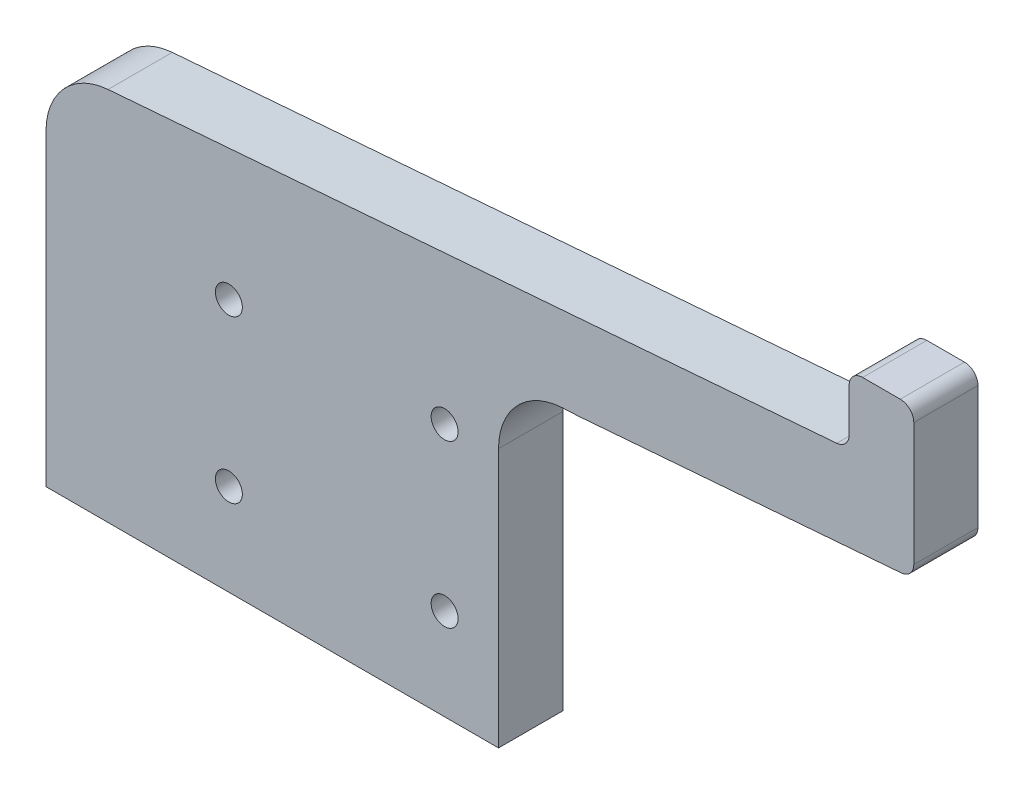
ISO-10303-21;
HEADER;
FILE_DESCRIPTION(('STEP AP214'),'2;1');
FILE_NAME('part.step','',(''),(''),'','','');
FILE_SCHEMA(('AUTOMOTIVE_DESIGN { 1 0 10303 214 1 1 1 1 }'));
ENDSEC;
DATA;
#1=APPLICATION_CONTEXT('core data for automotive mechanical design processes');
#2=APPLICATION_PROTOCOL_DEFINITION('international standard','automotive_design',2000,#1);
#3=PRODUCT_CONTEXT('',#1,'mechanical');
#4=PRODUCT('Part','Part','',(#3));
#5=PRODUCT_RELATED_PRODUCT_CATEGORY('part','',(#4));
#6=PRODUCT_DEFINITION_FORMATION('','',#4);
#7=PRODUCT_DEFINITION_CONTEXT('part definition',#1,'design');
#8=PRODUCT_DEFINITION('design','',#6,#7);
#9=PRODUCT_DEFINITION_SHAPE('','',#8);
#10=(LENGTH_UNIT() NAMED_UNIT(*) SI_UNIT(.MILLI.,.METRE.));
#11=(NAMED_UNIT(*) PLANE_ANGLE_UNIT() SI_UNIT($,.RADIAN.));
#12=(NAMED_UNIT(*) SI_UNIT($,.STERADIAN.) SOLID_ANGLE_UNIT());
#13=UNCERTAINTY_MEASURE_WITH_UNIT(LENGTH_MEASURE(1.E-05),#10,'distance_accuracy_value','');
#14=(GEOMETRIC_REPRESENTATION_CONTEXT(3) GLOBAL_UNCERTAINTY_ASSIGNED_CONTEXT((#13)) GLOBAL_UNIT_ASSIGNED_CONTEXT((#10,
#11,#12)) REPRESENTATION_CONTEXT('',''));
#15=CARTESIAN_POINT('',(0.,0.,0.));
#16=DIRECTION('',(0.,0.,1.));
#17=DIRECTION('',(1.,0.,0.));
#18=AXIS2_PLACEMENT_3D('',#15,#16,#17);
#19=CARTESIAN_POINT('',(48.,0.,6.35));
#20=DIRECTION('',(-1.,0.,0.));
#21=DIRECTION('',(0.,-1.,0.));
#22=AXIS2_PLACEMENT_3D('',#19,#20,#21);
#23=PLANE('',#22);
#24=DIRECTION('',(0.,1.,0.));
#25=VECTOR('',#24,1.);
#26=CARTESIAN_POINT('',(48.,0.,0.));
#27=LINE('',#26,#25);
#28=CARTESIAN_POINT('',(48.,-48.,0.));
#29=VERTEX_POINT('',#28);
#30=CARTESIAN_POINT('',(48.,-9.55341751649146,0.));
#31=VERTEX_POINT('',#30);
#32=EDGE_CURVE('E321',#29,#31,#27,.T.);
#33=ORIENTED_EDGE('',*,*,#32,.T.);
#34=DIRECTION('',(0.,0.,-1.));
#35=VECTOR('',#34,1.);
#36=CARTESIAN_POINT('',(48.,-9.55341751649146,6.35));
#37=LINE('',#36,#35);
#38=CARTESIAN_POINT('',(48.,-9.55341751649145,9.525));
#39=VERTEX_POINT('',#38);
#40=EDGE_CURVE('E422',#31,#39,#37,.F.);
#41=ORIENTED_EDGE('',*,*,#40,.T.);
#42=DIRECTION('',(0.,1.,0.));
#43=VECTOR('',#42,1.);
#44=CARTESIAN_POINT('',(48.,-48.,9.525));
#45=LINE('',#44,#43);
#46=CARTESIAN_POINT('',(48.,-48.,9.525));
#47=VERTEX_POINT('',#46);
#48=EDGE_CURVE('E248',#47,#39,#45,.T.);
#49=ORIENTED_EDGE('',*,*,#48,.F.);
#50=DIRECTION('',(0.,0.,-1.));
#51=VECTOR('',#50,1.);
#52=CARTESIAN_POINT('',(48.,-48.,6.35));
#53=LINE('',#52,#51);
#54=EDGE_CURVE('E413',#47,#29,#53,.T.);
#55=ORIENTED_EDGE('',*,*,#54,.T.);
#56=EDGE_LOOP('',(#33,#41,#49,#55));
#57=FACE_BOUND('',#56,.T.);
#58=ADVANCED_FACE('F35',(#57),#23,.F.);
#59=CARTESIAN_POINT('',(48.,0.,6.35));
#60=DIRECTION('',(-0.0456543881594155,0.998957294803832,0.));
#61=DIRECTION('',(-0.998957294803832,-0.0456543881594155,0.));
#62=AXIS2_PLACEMENT_3D('',#59,#60,#61);
#63=PLANE('',#62);
#64=DIRECTION('',(0.,0.,-1.));
#65=VECTOR('',#64,1.);
#66=CARTESIAN_POINT('',(59.6515632393399,0.532500231551201,6.35));
#67=LINE('',#66,#65);
#68=CARTESIAN_POINT('',(59.6515632393399,0.532500231551201,0.));
#69=VERTEX_POINT('',#68);
#70=CARTESIAN_POINT('',(59.6515632393399,0.5325002315512,9.525));
#71=VERTEX_POINT('',#70);
#72=EDGE_CURVE('E416',#69,#71,#67,.F.);
#73=ORIENTED_EDGE('',*,*,#72,.T.);
#74=DIRECTION('',(0.998957294803832,0.0456543881594152,0.));
#75=VECTOR('',#74,1.);
#76=CARTESIAN_POINT('',(57.5434561184058,0.43615543154686,9.525));
#77=LINE('',#76,#75);
#78=CARTESIAN_POINT('',(57.5434561184058,0.436155431546861,9.525));
#79=VERTEX_POINT('',#78);
#80=EDGE_CURVE('E256',#79,#71,#77,.T.);
#81=ORIENTED_EDGE('',*,*,#80,.F.);
#82=DIRECTION('',(0.,0.,-1.));
#83=VECTOR('',#82,1.);
#84=CARTESIAN_POINT('',(57.5434561184058,0.43615543154686,0.));
#85=LINE('',#84,#83);
#86=CARTESIAN_POINT('',(57.5434561184058,0.43615543154686,0.));
#87=VERTEX_POINT('',#86);
#88=EDGE_CURVE('E419',#79,#87,#85,.T.);
#89=ORIENTED_EDGE('',*,*,#88,.T.);
#90=DIRECTION('',(0.998957294803832,0.0456543881594155,0.));
#91=VECTOR('',#90,1.);
#92=CARTESIAN_POINT('',(48.,0.,0.));
#93=LINE('',#92,#91);
#94=EDGE_CURVE('E324',#87,#69,#93,.T.);
#95=ORIENTED_EDGE('',*,*,#94,.T.);
#96=EDGE_LOOP('',(#73,#81,#89,#95));
#97=FACE_BOUND('',#96,.T.);
#98=ADVANCED_FACE('F480',(#97),#63,.F.);
#99=CARTESIAN_POINT('',(59.8196674046978,0.540182935162639,6.35));
#100=DIRECTION('',(-0.0792398536366962,0.99685557910644,0.));
#101=DIRECTION('',(-0.99685557910644,-0.0792398536366962,0.));
#102=AXIS2_PLACEMENT_3D('',#99,#100,#101);
#103=PLANE('',#102);
#104=DIRECTION('',(0.99685557910644,0.0792398536366962,0.));
#105=VECTOR('',#104,1.);
#106=CARTESIAN_POINT('',(59.8196674046978,0.540182935162639,0.));
#107=LINE('',#106,#105);
#108=CARTESIAN_POINT('',(59.9874178941127,0.553517388525122,0.));
#109=VERTEX_POINT('',#108);
#110=CARTESIAN_POINT('',(107.745979707273,4.34983606024906,0.));
#111=VERTEX_POINT('',#110);
#112=EDGE_CURVE('E327',#109,#111,#107,.T.);
#113=ORIENTED_EDGE('',*,*,#112,.T.);
#114=DIRECTION('',(0.,0.,-1.));
#115=VECTOR('',#114,1.);
#116=CARTESIAN_POINT('',(107.745979707273,4.34983606024906,6.35));
#117=LINE('',#116,#115);
#118=CARTESIAN_POINT('',(107.745979707273,4.34983606024906,9.525));
#119=VERTEX_POINT('',#118);
#120=EDGE_CURVE('E443',#111,#119,#117,.F.);
#121=ORIENTED_EDGE('',*,*,#120,.T.);
#122=DIRECTION('',(0.996855579106439,0.0792398536366962,0.));
#123=VECTOR('',#122,1.);
#124=CARTESIAN_POINT('',(59.9874178941127,0.553517388525122,9.525));
#125=LINE('',#124,#123);
#126=CARTESIAN_POINT('',(59.9874178941127,0.55351738852512,9.525));
#127=VERTEX_POINT('',#126);
#128=EDGE_CURVE('E261',#127,#119,#125,.T.);
#129=ORIENTED_EDGE('',*,*,#128,.F.);
#130=DIRECTION('',(0.,0.,-1.));
#131=VECTOR('',#130,1.);
#132=CARTESIAN_POINT('',(59.9874178941127,0.553517388525122,6.35));
#133=LINE('',#132,#131);
#134=EDGE_CURVE('E425',#127,#109,#133,.T.);
#135=ORIENTED_EDGE('',*,*,#134,.T.);
#136=EDGE_LOOP('',(#113,#121,#129,#135));
#137=FACE_BOUND('',#136,.T.);
#138=ADVANCED_FACE('F488',(#137),#103,.F.);
#139=CARTESIAN_POINT('',(109.5875,4.49621814560135,6.35));
#140=DIRECTION('',(-1.,0.,0.));
#141=DIRECTION('',(0.,0.,1.));
#142=AXIS2_PLACEMENT_3D('',#139,#140,#141);
#143=PLANE('',#142);
#144=DIRECTION('',(0.,0.,-1.));
#145=VECTOR('',#144,1.);
#146=CARTESIAN_POINT('',(109.5875,24.592829183578,6.35));
#147=LINE('',#146,#145);
#148=CARTESIAN_POINT('',(109.5875,24.592829183578,0.));
#149=VERTEX_POINT('',#148);
#150=CARTESIAN_POINT('',(109.5875,24.592829183578,9.525));
#151=VERTEX_POINT('',#150);
#152=EDGE_CURVE('E433',#149,#151,#147,.F.);
#153=ORIENTED_EDGE('',*,*,#152,.T.);
#154=DIRECTION('',(0.,1.,0.));
#155=VECTOR('',#154,1.);
#156=CARTESIAN_POINT('',(109.5875,6.34354721846194,9.525));
#157=LINE('',#156,#155);
#158=CARTESIAN_POINT('',(109.5875,6.34354721846194,9.525));
#159=VERTEX_POINT('',#158);
#160=EDGE_CURVE('E266',#159,#151,#157,.T.);
#161=ORIENTED_EDGE('',*,*,#160,.F.);
#162=DIRECTION('',(0.,0.,-1.));
#163=VECTOR('',#162,1.);
#164=CARTESIAN_POINT('',(109.5875,6.34354721846194,6.35));
#165=LINE('',#164,#163);
#166=CARTESIAN_POINT('',(109.5875,6.34354721846194,0.));
#167=VERTEX_POINT('',#166);
#168=EDGE_CURVE('E436',#159,#167,#165,.T.);
#169=ORIENTED_EDGE('',*,*,#168,.T.);
#170=DIRECTION('',(0.,1.,0.));
#171=VECTOR('',#170,1.);
#172=CARTESIAN_POINT('',(109.5875,4.49621814560135,0.));
#173=LINE('',#172,#171);
#174=EDGE_CURVE('E330',#167,#149,#173,.T.);
#175=ORIENTED_EDGE('',*,*,#174,.T.);
#176=EDGE_LOOP('',(#153,#161,#169,#175));
#177=FACE_BOUND('',#176,.T.);
#178=ADVANCED_FACE('F495',(#177),#143,.F.);
#179=CARTESIAN_POINT('',(109.5875,26.592829183578,6.35));
#180=DIRECTION('',(0.,-1.,0.));
#181=DIRECTION('',(0.,0.,-1.));
#182=AXIS2_PLACEMENT_3D('',#179,#180,#181);
#183=PLANE('',#182);
#184=DIRECTION('',(0.,0.,-1.));
#185=VECTOR('',#184,1.);
#186=CARTESIAN_POINT('',(102.,26.592829183578,6.35));
#187=LINE('',#186,#185);
#188=CARTESIAN_POINT('',(102.,26.592829183578,0.));
#189=VERTEX_POINT('',#188);
#190=CARTESIAN_POINT('',(102.,26.592829183578,9.525));
#191=VERTEX_POINT('',#190);
#192=EDGE_CURVE('E446',#189,#191,#187,.F.);
#193=ORIENTED_EDGE('',*,*,#192,.T.);
#194=DIRECTION('',(-1.,0.,0.));
#195=VECTOR('',#194,1.);
#196=CARTESIAN_POINT('',(107.5875,26.592829183578,9.525));
#197=LINE('',#196,#195);
#198=CARTESIAN_POINT('',(107.5875,26.592829183578,9.525));
#199=VERTEX_POINT('',#198);
#200=EDGE_CURVE('E271',#199,#191,#197,.T.);
#201=ORIENTED_EDGE('',*,*,#200,.F.);
#202=DIRECTION('',(0.,0.,-1.));
#203=VECTOR('',#202,1.);
#204=CARTESIAN_POINT('',(107.5875,26.592829183578,6.35));
#205=LINE('',#204,#203);
#206=CARTESIAN_POINT('',(107.5875,26.592829183578,0.));
#207=VERTEX_POINT('',#206);
#208=EDGE_CURVE('E449',#199,#207,#205,.T.);
#209=ORIENTED_EDGE('',*,*,#208,.T.);
#210=DIRECTION('',(-1.,0.,0.));
#211=VECTOR('',#210,1.);
#212=CARTESIAN_POINT('',(109.5875,26.592829183578,0.));
#213=LINE('',#212,#211);
#214=EDGE_CURVE('E333',#207,#189,#213,.T.);
#215=ORIENTED_EDGE('',*,*,#214,.T.);
#216=EDGE_LOOP('',(#193,#201,#209,#215));
#217=FACE_BOUND('',#216,.T.);
#218=ADVANCED_FACE('F499',(#217),#183,.F.);
#219=CARTESIAN_POINT('',(100.,26.592829183578,6.35));
#220=DIRECTION('',(1.,0.,0.));
#221=DIRECTION('',(0.,0.,-1.));
#222=AXIS2_PLACEMENT_3D('',#219,#220,#221);
#223=PLANE('',#222);
#224=DIRECTION('',(0.,0.,-1.));
#225=VECTOR('',#224,1.);
#226=CARTESIAN_POINT('',(100.,18.2111518657295,6.35));
#227=LINE('',#226,#225);
#228=CARTESIAN_POINT('',(100.,18.2111518657295,0.));
#229=VERTEX_POINT('',#228);
#230=CARTESIAN_POINT('',(100.,18.2111518657295,9.525));
#231=VERTEX_POINT('',#230);
#232=EDGE_CURVE('E452',#229,#231,#227,.F.);
#233=ORIENTED_EDGE('',*,*,#232,.T.);
#234=DIRECTION('',(0.,-1.,0.));
#235=VECTOR('',#234,1.);
#236=CARTESIAN_POINT('',(100.,24.592829183578,9.525));
#237=LINE('',#236,#235);
#238=CARTESIAN_POINT('',(100.,24.592829183578,9.525));
#239=VERTEX_POINT('',#238);
#240=EDGE_CURVE('E276',#239,#231,#237,.T.);
#241=ORIENTED_EDGE('',*,*,#240,.F.);
#242=DIRECTION('',(0.,0.,-1.));
#243=VECTOR('',#242,1.);
#244=CARTESIAN_POINT('',(100.,24.592829183578,6.35));
#245=LINE('',#244,#243);
#246=CARTESIAN_POINT('',(100.,24.592829183578,0.));
#247=VERTEX_POINT('',#246);
#248=EDGE_CURVE('E455',#239,#247,#245,.T.);
#249=ORIENTED_EDGE('',*,*,#248,.T.);
#250=DIRECTION('',(0.,-1.,0.));
#251=VECTOR('',#250,1.);
#252=CARTESIAN_POINT('',(100.,26.592829183578,0.));
#253=LINE('',#252,#251);
#254=EDGE_CURVE('E335',#247,#229,#253,.T.);
#255=ORIENTED_EDGE('',*,*,#254,.T.);
#256=EDGE_LOOP('',(#233,#241,#249,#255));
#257=FACE_BOUND('',#256,.T.);
#258=ADVANCED_FACE('F506',(#257),#223,.F.);
#259=CARTESIAN_POINT('',(100.,16.3638227928689,6.35));
#260=DIRECTION('',(0.0792398536366963,-0.99685557910644,0.));
#261=DIRECTION('',(0.99685557910644,0.0792398536366963,0.));
#262=AXIS2_PLACEMENT_3D('',#259,#260,#261);
#263=PLANE('',#262);
#264=DIRECTION('',(0.,0.,-1.));
#265=VECTOR('',#264,1.);
#266=CARTESIAN_POINT('',(-9.91239853636693,7.62690788219861,6.35));
#267=LINE('',#266,#265);
#268=CARTESIAN_POINT('',(-9.91239853636693,7.62690788219861,0.));
#269=VERTEX_POINT('',#268);
#270=CARTESIAN_POINT('',(-9.91239853636693,7.62690788219861,9.525));
#271=VERTEX_POINT('',#270);
#272=EDGE_CURVE('E240',#269,#271,#267,.F.);
#273=ORIENTED_EDGE('',*,*,#272,.T.);
#274=DIRECTION('',(-0.99685557910644,-0.0792398536366963,0.));
#275=VECTOR('',#274,1.);
#276=CARTESIAN_POINT('',(98.1584797072734,16.2174407075166,9.525));
#277=LINE('',#276,#275);
#278=CARTESIAN_POINT('',(98.1584797072734,16.2174407075166,9.525));
#279=VERTEX_POINT('',#278);
#280=EDGE_CURVE('E227',#279,#271,#277,.T.);
#281=ORIENTED_EDGE('',*,*,#280,.F.);
#282=DIRECTION('',(0.,0.,-1.));
#283=VECTOR('',#282,1.);
#284=CARTESIAN_POINT('',(98.1584797072734,16.2174407075166,0.));
#285=LINE('',#284,#283);
#286=CARTESIAN_POINT('',(98.1584797072734,16.2174407075166,0.));
#287=VERTEX_POINT('',#286);
#288=EDGE_CURVE('E43',#279,#287,#285,.T.);
#289=ORIENTED_EDGE('',*,*,#288,.T.);
#290=DIRECTION('',(-0.99685557910644,-0.0792398536366963,0.));
#291=VECTOR('',#290,1.);
#292=CARTESIAN_POINT('',(100.,16.3638227928689,0.));
#293=LINE('',#292,#291);
#294=EDGE_CURVE('E338',#287,#269,#293,.T.);
#295=ORIENTED_EDGE('',*,*,#294,.T.);
#296=EDGE_LOOP('',(#273,#281,#289,#295));
#297=FACE_BOUND('',#296,.T.);
#298=ADVANCED_FACE('F460',(#297),#263,.F.);
#299=CARTESIAN_POINT('',(-19.12,6.89499745543717,6.35));
#300=DIRECTION('',(1.,0.,0.));
#301=DIRECTION('',(0.,1.,0.));
#302=AXIS2_PLACEMENT_3D('',#299,#300,#301);
#303=PLANE('',#302);
#304=DIRECTION('',(0.,0.,-1.));
#305=VECTOR('',#304,1.);
#306=CARTESIAN_POINT('',(-19.12,-48.,6.35));
#307=LINE('',#306,#305);
#308=CARTESIAN_POINT('',(-19.12,-48.,9.525));
#309=VERTEX_POINT('',#308);
#310=CARTESIAN_POINT('',(-19.12,-48.,0.));
#311=VERTEX_POINT('',#310);
#312=EDGE_CURVE('E245',#309,#311,#307,.T.);
#313=ORIENTED_EDGE('',*,*,#312,.F.);
#314=DIRECTION('',(0.,-1.,0.));
#315=VECTOR('',#314,1.);
#316=CARTESIAN_POINT('',(-19.12,-2.34164790886579,9.525));
#317=LINE('',#316,#315);
#318=CARTESIAN_POINT('',(-19.12,-2.34164790886579,9.525));
#319=VERTEX_POINT('',#318);
#320=EDGE_CURVE('E224',#319,#309,#317,.T.);
#321=ORIENTED_EDGE('',*,*,#320,.F.);
#322=DIRECTION('',(0.,0.,-1.));
#323=VECTOR('',#322,1.);
#324=CARTESIAN_POINT('',(-19.12,-2.34164790886579,6.35));
#325=LINE('',#324,#323);
#326=CARTESIAN_POINT('',(-19.12,-2.34164790886579,0.));
#327=VERTEX_POINT('',#326);
#328=EDGE_CURVE('E234',#319,#327,#325,.T.);
#329=ORIENTED_EDGE('',*,*,#328,.T.);
#330=DIRECTION('',(0.,-1.,0.));
#331=VECTOR('',#330,1.);
#332=CARTESIAN_POINT('',(-19.12,6.89499745543717,0.));
#333=LINE('',#332,#331);
#334=EDGE_CURVE('E341',#327,#311,#333,.T.);
#335=ORIENTED_EDGE('',*,*,#334,.T.);
#336=EDGE_LOOP('',(#313,#321,#329,#335));
#337=FACE_BOUND('',#336,.T.);
#338=ADVANCED_FACE('F243',(#337),#303,.F.);
#339=CARTESIAN_POINT('',(-19.12,-48.,6.35));
#340=DIRECTION('',(0.,1.,0.));
#341=DIRECTION('',(0.,0.,1.));
#342=AXIS2_PLACEMENT_3D('',#339,#340,#341);
#343=PLANE('',#342);
#344=DIRECTION('',(1.,0.,0.));
#345=VECTOR('',#344,1.);
#346=CARTESIAN_POINT('',(-19.12,-48.,0.));
#347=LINE('',#346,#345);
#348=CARTESIAN_POINT('',(-16.12,-48.,0.));
#349=VERTEX_POINT('',#348);
#350=EDGE_CURVE('E343',#311,#349,#347,.T.);
#351=ORIENTED_EDGE('',*,*,#350,.T.);
#352=DIRECTION('',(0.,0.,-1.));
#353=VECTOR('',#352,1.);
#354=CARTESIAN_POINT('',(-16.12,-48.,6.35));
#355=LINE('',#354,#353);
#356=CARTESIAN_POINT('',(-16.12,-48.,6.35));
#357=VERTEX_POINT('',#356);
#358=EDGE_CURVE('E409',#357,#349,#355,.T.);
#359=ORIENTED_EDGE('',*,*,#358,.F.);
#360=DIRECTION('',(1.,0.,0.));
#361=VECTOR('',#360,1.);
#362=CARTESIAN_POINT('',(-16.12,-48.,6.35));
#363=LINE('',#362,#361);
#364=CARTESIAN_POINT('',(-14.53,-48.,6.35));
#365=VERTEX_POINT('',#364);
#366=EDGE_CURVE('E231',#357,#365,#363,.T.);
#367=ORIENTED_EDGE('',*,*,#366,.T.);
#368=DIRECTION('',(0.,0.,-1.));
#369=VECTOR('',#368,1.);
#370=CARTESIAN_POINT('',(-14.53,-48.,6.35));
#371=LINE('',#370,#369);
#372=CARTESIAN_POINT('',(-14.53,-48.,0.));
#373=VERTEX_POINT('',#372);
#374=EDGE_CURVE('E319',#365,#373,#371,.T.);
#375=ORIENTED_EDGE('',*,*,#374,.T.);
#376=DIRECTION('',(1.,0.,0.));
#377=VECTOR('',#376,1.);
#378=CARTESIAN_POINT('',(-14.53,-48.,0.));
#379=LINE('',#378,#377);
#380=EDGE_CURVE('E282',#373,#29,#379,.T.);
#381=ORIENTED_EDGE('',*,*,#380,.T.);
#382=ORIENTED_EDGE('',*,*,#54,.F.);
#383=DIRECTION('',(1.,0.,0.));
#384=VECTOR('',#383,1.);
#385=CARTESIAN_POINT('',(-19.12,-48.,9.525));
#386=LINE('',#385,#384);
#387=EDGE_CURVE('E246',#309,#47,#386,.T.);
#388=ORIENTED_EDGE('',*,*,#387,.F.);
#389=ORIENTED_EDGE('',*,*,#312,.T.);
#390=EDGE_LOOP('',(#351,#359,#367,#375,#381,#382,#388,#389));
#391=FACE_BOUND('',#390,.T.);
#392=ADVANCED_FACE('F467',(#391),#343,.F.);
#393=CARTESIAN_POINT('',(-16.12,-5.11264151815669,6.35));
#394=DIRECTION('',(-1.,0.,0.));
#395=DIRECTION('',(0.,-1.,0.));
#396=AXIS2_PLACEMENT_3D('',#393,#394,#395);
#397=PLANE('',#396);
#398=DIRECTION('',(0.,1.,0.));
#399=VECTOR('',#398,1.);
#400=CARTESIAN_POINT('',(-16.12,-5.11264151815669,0.));
#401=LINE('',#400,#399);
#402=CARTESIAN_POINT('',(-16.12,-5.11264151815669,0.));
#403=VERTEX_POINT('',#402);
#404=EDGE_CURVE('E346',#349,#403,#401,.T.);
#405=ORIENTED_EDGE('',*,*,#404,.T.);
#406=DIRECTION('',(0.,0.,-1.));
#407=VECTOR('',#406,1.);
#408=CARTESIAN_POINT('',(-16.12,-5.11264151815669,6.35));
#409=LINE('',#408,#407);
#410=CARTESIAN_POINT('',(-16.12,-5.11264151815669,6.35));
#411=VERTEX_POINT('',#410);
#412=EDGE_CURVE('E406',#411,#403,#409,.T.);
#413=ORIENTED_EDGE('',*,*,#412,.F.);
#414=DIRECTION('',(0.,1.,0.));
#415=VECTOR('',#414,1.);
#416=CARTESIAN_POINT('',(-16.12,-5.11264151815669,6.35));
#417=LINE('',#416,#415);
#418=EDGE_CURVE('E286',#357,#411,#417,.T.);
#419=ORIENTED_EDGE('',*,*,#418,.F.);
#420=ORIENTED_EDGE('',*,*,#358,.T.);
#421=EDGE_LOOP('',(#405,#413,#419,#420));
#422=FACE_BOUND('',#421,.T.);
#423=ADVANCED_FACE('F593',(#422),#397,.F.);
#424=CARTESIAN_POINT('',(-6.11999999999999,-5.11264151815668,6.35));
#425=DIRECTION('',(0.,0.,-1.));
#426=DIRECTION('',(-1.,0.,0.));
#427=AXIS2_PLACEMENT_3D('',#424,#425,#426);
#428=CYLINDRICAL_SURFACE('',#427,10.);
#429=CARTESIAN_POINT('',(-6.11999999999999,-5.11264151815668,0.));
#430=DIRECTION('',(0.,0.,-1.));
#431=DIRECTION('',(1.,0.,0.));
#432=AXIS2_PLACEMENT_3D('',#429,#430,#431);
#433=CIRCLE('',#432,10.);
#434=CARTESIAN_POINT('',(-6.91239853636694,4.85591427290772,0.));
#435=VERTEX_POINT('',#434);
#436=EDGE_CURVE('E349',#403,#435,#433,.T.);
#437=ORIENTED_EDGE('',*,*,#436,.T.);
#438=DIRECTION('',(0.,0.,-1.));
#439=VECTOR('',#438,1.);
#440=CARTESIAN_POINT('',(-6.91239853636694,4.85591427290772,6.35));
#441=LINE('',#440,#439);
#442=CARTESIAN_POINT('',(-6.91239853636694,4.85591427290772,6.35));
#443=VERTEX_POINT('',#442);
#444=EDGE_CURVE('E403',#443,#435,#441,.T.);
#445=ORIENTED_EDGE('',*,*,#444,.F.);
#446=CARTESIAN_POINT('',(-6.11999999999999,-5.11264151815668,6.35));
#447=DIRECTION('',(0.,0.,-1.));
#448=DIRECTION('',(1.,0.,0.));
#449=AXIS2_PLACEMENT_3D('',#446,#447,#448);
#450=CIRCLE('',#449,10.);
#451=EDGE_CURVE('E289',#411,#443,#450,.T.);
#452=ORIENTED_EDGE('',*,*,#451,.F.);
#453=ORIENTED_EDGE('',*,*,#412,.T.);
#454=EDGE_LOOP('',(#437,#445,#452,#453));
#455=FACE_BOUND('',#454,.T.);
#456=ADVANCED_FACE('F589',(#455),#428,.F.);
#457=CARTESIAN_POINT('',(99.3169594145468,13.3000650128734,6.35));
#458=DIRECTION('',(-0.0792398536366961,0.99685557910644,0.));
#459=DIRECTION('',(-0.99685557910644,-0.0792398536366962,0.));
#460=AXIS2_PLACEMENT_3D('',#457,#458,#459);
#461=PLANE('',#460);
#462=DIRECTION('',(0.99685557910644,0.0792398536366962,0.));
#463=VECTOR('',#462,1.);
#464=CARTESIAN_POINT('',(99.3169594145468,13.3000650128734,0.));
#465=LINE('',#464,#463);
#466=CARTESIAN_POINT('',(99.3169594145468,13.3000650128734,0.));
#467=VERTEX_POINT('',#466);
#468=EDGE_CURVE('E352',#435,#467,#465,.T.);
#469=ORIENTED_EDGE('',*,*,#468,.T.);
#470=DIRECTION('',(0.,0.,-1.));
#471=VECTOR('',#470,1.);
#472=CARTESIAN_POINT('',(99.3169594145468,13.3000650128734,6.35));
#473=LINE('',#472,#471);
#474=CARTESIAN_POINT('',(99.3169594145468,13.3000650128734,6.35));
#475=VERTEX_POINT('',#474);
#476=EDGE_CURVE('E400',#475,#467,#473,.T.);
#477=ORIENTED_EDGE('',*,*,#476,.F.);
#478=DIRECTION('',(0.99685557910644,0.0792398536366962,0.));
#479=VECTOR('',#478,1.);
#480=CARTESIAN_POINT('',(99.3169594145468,13.3000650128734,6.35));
#481=LINE('',#480,#479);
#482=EDGE_CURVE('E293',#443,#475,#481,.T.);
#483=ORIENTED_EDGE('',*,*,#482,.F.);
#484=ORIENTED_EDGE('',*,*,#444,.T.);
#485=EDGE_LOOP('',(#469,#477,#483,#484));
#486=FACE_BOUND('',#485,.T.);
#487=ADVANCED_FACE('F585',(#486),#461,.F.);
#488=CARTESIAN_POINT('',(99.,17.2874873292992,6.35));
#489=DIRECTION('',(0.,0.,-1.));
#490=DIRECTION('',(-1.,0.,0.));
#491=AXIS2_PLACEMENT_3D('',#488,#489,#490);
#492=CYLINDRICAL_SURFACE('',#491,4.);
#493=CARTESIAN_POINT('',(99.,17.2874873292992,0.));
#494=DIRECTION('',(0.,0.,1.));
#495=DIRECTION('',(1.,0.,0.));
#496=AXIS2_PLACEMENT_3D('',#493,#494,#495);
#497=CIRCLE('',#496,4.);
#498=CARTESIAN_POINT('',(103.,17.2874873292992,0.));
#499=VERTEX_POINT('',#498);
#500=EDGE_CURVE('E355',#467,#499,#497,.T.);
#501=ORIENTED_EDGE('',*,*,#500,.T.);
#502=DIRECTION('',(0.,0.,-1.));
#503=VECTOR('',#502,1.);
#504=CARTESIAN_POINT('',(103.,17.2874873292992,6.35));
#505=LINE('',#504,#503);
#506=CARTESIAN_POINT('',(103.,17.2874873292992,6.35));
#507=VERTEX_POINT('',#506);
#508=EDGE_CURVE('E397',#507,#499,#505,.T.);
#509=ORIENTED_EDGE('',*,*,#508,.F.);
#510=CARTESIAN_POINT('',(99.,17.2874873292992,6.35));
#511=DIRECTION('',(0.,0.,1.));
#512=DIRECTION('',(1.,0.,0.));
#513=AXIS2_PLACEMENT_3D('',#510,#511,#512);
#514=CIRCLE('',#513,4.);
#515=EDGE_CURVE('E296',#475,#507,#514,.T.);
#516=ORIENTED_EDGE('',*,*,#515,.F.);
#517=ORIENTED_EDGE('',*,*,#476,.T.);
#518=EDGE_LOOP('',(#501,#509,#516,#517));
#519=FACE_BOUND('',#518,.T.);
#520=ADVANCED_FACE('F581',(#519),#492,.T.);
#521=CARTESIAN_POINT('',(103.,23.592829183578,6.35));
#522=DIRECTION('',(-1.,0.,0.));
#523=DIRECTION('',(0.,0.,1.));
#524=AXIS2_PLACEMENT_3D('',#521,#522,#523);
#525=PLANE('',#524);
#526=DIRECTION('',(0.,1.,0.));
#527=VECTOR('',#526,1.);
#528=CARTESIAN_POINT('',(103.,23.592829183578,0.));
#529=LINE('',#528,#527);
#530=CARTESIAN_POINT('',(103.,23.592829183578,0.));
#531=VERTEX_POINT('',#530);
#532=EDGE_CURVE('E358',#499,#531,#529,.T.);
#533=ORIENTED_EDGE('',*,*,#532,.T.);
#534=DIRECTION('',(0.,0.,-1.));
#535=VECTOR('',#534,1.);
#536=CARTESIAN_POINT('',(103.,23.592829183578,6.35));
#537=LINE('',#536,#535);
#538=CARTESIAN_POINT('',(103.,23.592829183578,6.35));
#539=VERTEX_POINT('',#538);
#540=EDGE_CURVE('E394',#539,#531,#537,.T.);
#541=ORIENTED_EDGE('',*,*,#540,.F.);
#542=DIRECTION('',(0.,1.,0.));
#543=VECTOR('',#542,1.);
#544=CARTESIAN_POINT('',(103.,23.592829183578,6.35));
#545=LINE('',#544,#543);
#546=EDGE_CURVE('E299',#507,#539,#545,.T.);
#547=ORIENTED_EDGE('',*,*,#546,.F.);
#548=ORIENTED_EDGE('',*,*,#508,.T.);
#549=EDGE_LOOP('',(#533,#541,#547,#548));
#550=FACE_BOUND('',#549,.T.);
#551=ADVANCED_FACE('F577',(#550),#525,.F.);
#552=CARTESIAN_POINT('',(104.5875,23.592829183578,6.35));
#553=DIRECTION('',(0.,1.,0.));
#554=DIRECTION('',(0.,0.,1.));
#555=AXIS2_PLACEMENT_3D('',#552,#553,#554);
#556=PLANE('',#555);
#557=DIRECTION('',(1.,0.,0.));
#558=VECTOR('',#557,1.);
#559=CARTESIAN_POINT('',(104.5875,23.592829183578,0.));
#560=LINE('',#559,#558);
#561=CARTESIAN_POINT('',(104.5875,23.592829183578,0.));
#562=VERTEX_POINT('',#561);
#563=EDGE_CURVE('E361',#531,#562,#560,.T.);
#564=ORIENTED_EDGE('',*,*,#563,.T.);
#565=DIRECTION('',(0.,0.,-1.));
#566=VECTOR('',#565,1.);
#567=CARTESIAN_POINT('',(104.5875,23.592829183578,6.35));
#568=LINE('',#567,#566);
#569=CARTESIAN_POINT('',(104.5875,23.592829183578,6.35));
#570=VERTEX_POINT('',#569);
#571=EDGE_CURVE('E391',#570,#562,#568,.T.);
#572=ORIENTED_EDGE('',*,*,#571,.F.);
#573=DIRECTION('',(1.,0.,0.));
#574=VECTOR('',#573,1.);
#575=CARTESIAN_POINT('',(104.5875,23.592829183578,6.35));
#576=LINE('',#575,#574);
#577=EDGE_CURVE('E302',#539,#570,#576,.T.);
#578=ORIENTED_EDGE('',*,*,#577,.F.);
#579=ORIENTED_EDGE('',*,*,#540,.T.);
#580=EDGE_LOOP('',(#564,#572,#578,#579));
#581=FACE_BOUND('',#580,.T.);
#582=ADVANCED_FACE('F573',(#581),#556,.F.);
#583=CARTESIAN_POINT('',(104.5875,15.8186619918674,6.35));
#584=DIRECTION('',(1.,0.,0.));
#585=DIRECTION('',(0.,0.,-1.));
#586=AXIS2_PLACEMENT_3D('',#583,#584,#585);
#587=PLANE('',#586);
#588=DIRECTION('',(0.,-1.,0.));
#589=VECTOR('',#588,1.);
#590=CARTESIAN_POINT('',(104.5875,15.8186619918674,0.));
#591=LINE('',#590,#589);
#592=CARTESIAN_POINT('',(104.5875,15.8186619918674,0.));
#593=VERTEX_POINT('',#592);
#594=EDGE_CURVE('E364',#562,#593,#591,.T.);
#595=ORIENTED_EDGE('',*,*,#594,.T.);
#596=DIRECTION('',(0.,0.,-1.));
#597=VECTOR('',#596,1.);
#598=CARTESIAN_POINT('',(104.5875,15.8186619918674,6.35));
#599=LINE('',#598,#597);
#600=CARTESIAN_POINT('',(104.5875,15.8186619918674,6.35));
#601=VERTEX_POINT('',#600);
#602=EDGE_CURVE('E388',#601,#593,#599,.T.);
#603=ORIENTED_EDGE('',*,*,#602,.F.);
#604=DIRECTION('',(0.,-1.,0.));
#605=VECTOR('',#604,1.);
#606=CARTESIAN_POINT('',(104.5875,15.8186619918674,6.35));
#607=LINE('',#606,#605);
#608=EDGE_CURVE('E305',#570,#601,#607,.T.);
#609=ORIENTED_EDGE('',*,*,#608,.F.);
#610=ORIENTED_EDGE('',*,*,#571,.T.);
#611=EDGE_LOOP('',(#595,#603,#609,#610));
#612=FACE_BOUND('',#611,.T.);
#613=ADVANCED_FACE('F569',(#612),#587,.F.);
#614=CARTESIAN_POINT('',(100.5875,15.8186619918674,6.35));
#615=DIRECTION('',(0.,0.,-1.));
#616=DIRECTION('',(-1.,0.,0.));
#617=AXIS2_PLACEMENT_3D('',#614,#615,#616);
#618=CYLINDRICAL_SURFACE('',#617,4.);
#619=CARTESIAN_POINT('',(100.5875,15.8186619918674,0.));
#620=DIRECTION('',(0.,0.,-1.));
#621=DIRECTION('',(1.,0.,0.));
#622=AXIS2_PLACEMENT_3D('',#619,#620,#621);
#623=CIRCLE('',#622,4.);
#624=CARTESIAN_POINT('',(100.904459414547,11.8312396754417,0.));
#625=VERTEX_POINT('',#624);
#626=EDGE_CURVE('E367',#593,#625,#623,.T.);
#627=ORIENTED_EDGE('',*,*,#626,.T.);
#628=DIRECTION('',(0.,0.,-1.));
#629=VECTOR('',#628,1.);
#630=CARTESIAN_POINT('',(100.904459414547,11.8312396754417,6.35));
#631=LINE('',#630,#629);
#632=CARTESIAN_POINT('',(100.904459414547,11.8312396754417,6.35));
#633=VERTEX_POINT('',#632);
#634=EDGE_CURVE('E385',#633,#625,#631,.T.);
#635=ORIENTED_EDGE('',*,*,#634,.F.);
#636=CARTESIAN_POINT('',(100.5875,15.8186619918674,6.35));
#637=DIRECTION('',(0.,0.,-1.));
#638=DIRECTION('',(1.,0.,0.));
#639=AXIS2_PLACEMENT_3D('',#636,#637,#638);
#640=CIRCLE('',#639,4.);
#641=EDGE_CURVE('E308',#601,#633,#640,.T.);
#642=ORIENTED_EDGE('',*,*,#641,.F.);
#643=ORIENTED_EDGE('',*,*,#602,.T.);
#644=EDGE_LOOP('',(#627,#635,#642,#643));
#645=FACE_BOUND('',#644,.T.);
#646=ADVANCED_FACE('F565',(#645),#618,.F.);
#647=CARTESIAN_POINT('',(-5.32239853636693,3.38728765998354,6.35));
#648=DIRECTION('',(0.0792398536366962,-0.99685557910644,0.));
#649=DIRECTION('',(0.99685557910644,0.0792398536366962,0.));
#650=AXIS2_PLACEMENT_3D('',#647,#648,#649);
#651=PLANE('',#650);
#652=DIRECTION('',(-0.99685557910644,-0.0792398536366962,0.));
#653=VECTOR('',#652,1.);
#654=CARTESIAN_POINT('',(-5.32239853636693,3.38728765998354,0.));
#655=LINE('',#654,#653);
#656=CARTESIAN_POINT('',(-5.32239853636693,3.38728765998354,0.));
#657=VERTEX_POINT('',#656);
#658=EDGE_CURVE('E370',#625,#657,#655,.T.);
#659=ORIENTED_EDGE('',*,*,#658,.T.);
#660=DIRECTION('',(0.,0.,-1.));
#661=VECTOR('',#660,1.);
#662=CARTESIAN_POINT('',(-5.32239853636693,3.38728765998354,6.35));
#663=LINE('',#662,#661);
#664=CARTESIAN_POINT('',(-5.32239853636693,3.38728765998354,6.35));
#665=VERTEX_POINT('',#664);
#666=EDGE_CURVE('E382',#665,#657,#663,.T.);
#667=ORIENTED_EDGE('',*,*,#666,.F.);
#668=DIRECTION('',(-0.99685557910644,-0.0792398536366962,0.));
#669=VECTOR('',#668,1.);
#670=CARTESIAN_POINT('',(-5.32239853636693,3.38728765998354,6.35));
#671=LINE('',#670,#669);
#672=EDGE_CURVE('E311',#633,#665,#671,.T.);
#673=ORIENTED_EDGE('',*,*,#672,.F.);
#674=ORIENTED_EDGE('',*,*,#634,.T.);
#675=EDGE_LOOP('',(#659,#667,#673,#674));
#676=FACE_BOUND('',#675,.T.);
#677=ADVANCED_FACE('F561',(#676),#651,.F.);
#678=CARTESIAN_POINT('',(-4.52999999999998,-6.58126813108086,6.35));
#679=DIRECTION('',(0.,0.,-1.));
#680=DIRECTION('',(-1.,0.,0.));
#681=AXIS2_PLACEMENT_3D('',#678,#679,#680);
#682=CYLINDRICAL_SURFACE('',#681,10.);
#683=CARTESIAN_POINT('',(-4.52999999999998,-6.58126813108086,0.));
#684=DIRECTION('',(0.,0.,1.));
#685=DIRECTION('',(1.,0.,0.));
#686=AXIS2_PLACEMENT_3D('',#683,#684,#685);
#687=CIRCLE('',#686,10.);
#688=CARTESIAN_POINT('',(-14.53,-6.58126813108086,0.));
#689=VERTEX_POINT('',#688);
#690=EDGE_CURVE('E373',#657,#689,#687,.T.);
#691=ORIENTED_EDGE('',*,*,#690,.T.);
#692=DIRECTION('',(0.,0.,-1.));
#693=VECTOR('',#692,1.);
#694=CARTESIAN_POINT('',(-14.53,-6.58126813108086,6.35));
#695=LINE('',#694,#693);
#696=CARTESIAN_POINT('',(-14.53,-6.58126813108086,6.35));
#697=VERTEX_POINT('',#696);
#698=EDGE_CURVE('E379',#697,#689,#695,.T.);
#699=ORIENTED_EDGE('',*,*,#698,.F.);
#700=CARTESIAN_POINT('',(-4.52999999999998,-6.58126813108086,6.35));
#701=DIRECTION('',(0.,0.,1.));
#702=DIRECTION('',(1.,0.,0.));
#703=AXIS2_PLACEMENT_3D('',#700,#701,#702);
#704=CIRCLE('',#703,10.);
#705=EDGE_CURVE('E314',#665,#697,#704,.T.);
#706=ORIENTED_EDGE('',*,*,#705,.F.);
#707=ORIENTED_EDGE('',*,*,#666,.T.);
#708=EDGE_LOOP('',(#691,#699,#706,#707));
#709=FACE_BOUND('',#708,.T.);
#710=ADVANCED_FACE('F557',(#709),#682,.T.);
#711=CARTESIAN_POINT('',(-14.53,-48.,6.35));
#712=DIRECTION('',(1.,0.,0.));
#713=DIRECTION('',(0.,0.,-1.));
#714=AXIS2_PLACEMENT_3D('',#711,#712,#713);
#715=PLANE('',#714);
#716=DIRECTION('',(0.,-1.,0.));
#717=VECTOR('',#716,1.);
#718=CARTESIAN_POINT('',(-14.53,-48.,0.));
#719=LINE('',#718,#717);
#720=EDGE_CURVE('E290',#689,#373,#719,.T.);
#721=ORIENTED_EDGE('',*,*,#720,.T.);
#722=ORIENTED_EDGE('',*,*,#374,.F.);
#723=DIRECTION('',(0.,-1.,0.));
#724=VECTOR('',#723,1.);
#725=CARTESIAN_POINT('',(-14.53,-48.,6.35));
#726=LINE('',#725,#724);
#727=EDGE_CURVE('E317',#697,#365,#726,.T.);
#728=ORIENTED_EDGE('',*,*,#727,.F.);
#729=ORIENTED_EDGE('',*,*,#698,.T.);
#730=EDGE_LOOP('',(#721,#722,#728,#729));
#731=FACE_BOUND('',#730,.T.);
#732=ADVANCED_FACE('F553',(#731),#715,.F.);
#733=CARTESIAN_POINT('',(-6.11999999999999,-5.11264151815668,0.));
#734=DIRECTION('',(0.,0.,1.));
#735=DIRECTION('',(1.,0.,0.));
#736=AXIS2_PLACEMENT_3D('',#733,#734,#735);
#737=PLANE('',#736);
#738=CARTESIAN_POINT('',(40.,-10.4071708164219,0.));
#739=DIRECTION('',(0.,0.,1.));
#740=DIRECTION('',(1.,0.,0.));
#741=AXIS2_PLACEMENT_3D('',#738,#739,#740);
#742=CIRCLE('',#741,2.);
#743=CARTESIAN_POINT('',(42.,-10.4071708164219,0.));
#744=VERTEX_POINT('',#743);
#745=EDGE_CURVE('E767',#744,#744,#742,.T.);
#746=ORIENTED_EDGE('',*,*,#745,.T.);
#747=EDGE_LOOP('',(#746));
#748=FACE_BOUND('',#747,.T.);
#749=CARTESIAN_POINT('',(8.00000000000002,-34.4071708164219,0.));
#750=DIRECTION('',(0.,0.,1.));
#751=DIRECTION('',(1.,0.,0.));
#752=AXIS2_PLACEMENT_3D('',#749,#750,#751);
#753=CIRCLE('',#752,2.);
#754=CARTESIAN_POINT('',(10.,-34.4071708164219,0.));
#755=VERTEX_POINT('',#754);
#756=EDGE_CURVE('E771',#755,#755,#753,.T.);
#757=ORIENTED_EDGE('',*,*,#756,.T.);
#758=EDGE_LOOP('',(#757));
#759=FACE_BOUND('',#758,.T.);
#760=CARTESIAN_POINT('',(40.,-34.4071708164219,0.));
#761=DIRECTION('',(0.,0.,1.));
#762=DIRECTION('',(1.,0.,0.));
#763=AXIS2_PLACEMENT_3D('',#760,#761,#762);
#764=CIRCLE('',#763,2.);
#765=CARTESIAN_POINT('',(42.,-34.4071708164219,0.));
#766=VERTEX_POINT('',#765);
#767=EDGE_CURVE('E782',#766,#766,#764,.T.);
#768=ORIENTED_EDGE('',*,*,#767,.T.);
#769=EDGE_LOOP('',(#768));
#770=FACE_BOUND('',#769,.T.);
#771=CARTESIAN_POINT('',(8.00000000000002,-10.4071708164219,0.));
#772=DIRECTION('',(0.,0.,1.));
#773=DIRECTION('',(1.,0.,0.));
#774=AXIS2_PLACEMENT_3D('',#771,#772,#773);
#775=CIRCLE('',#774,2.);
#776=CARTESIAN_POINT('',(10.,-10.4071708164219,0.));
#777=VERTEX_POINT('',#776);
#778=EDGE_CURVE('E285',#777,#777,#775,.T.);
#779=ORIENTED_EDGE('',*,*,#778,.T.);
#780=EDGE_LOOP('',(#779));
#781=FACE_BOUND('',#780,.T.);
#782=ORIENTED_EDGE('',*,*,#174,.F.);
#783=CARTESIAN_POINT('',(107.5875,6.34354721846194,0.));
#784=DIRECTION('',(0.,0.,1.));
#785=DIRECTION('',(1.,0.,0.));
#786=AXIS2_PLACEMENT_3D('',#783,#784,#785);
#787=CIRCLE('',#786,2.);
#788=EDGE_CURVE('E441',#167,#111,#787,.F.);
#789=ORIENTED_EDGE('',*,*,#788,.T.);
#790=ORIENTED_EDGE('',*,*,#112,.F.);
#791=CARTESIAN_POINT('',(59.1950193577458,10.5220731795895,0.));
#792=DIRECTION('',(0.,0.,1.));
#793=DIRECTION('',(1.,0.,0.));
#794=AXIS2_PLACEMENT_3D('',#791,#792,#793);
#795=CIRCLE('',#794,10.);
#796=EDGE_CURVE('E241',#109,#69,#795,.F.);
#797=ORIENTED_EDGE('',*,*,#796,.T.);
#798=ORIENTED_EDGE('',*,*,#94,.F.);
#799=CARTESIAN_POINT('',(58.,-9.55341751649146,0.));
#800=DIRECTION('',(0.,0.,1.));
#801=DIRECTION('',(1.,0.,0.));
#802=AXIS2_PLACEMENT_3D('',#799,#800,#801);
#803=CIRCLE('',#802,10.);
#804=EDGE_CURVE('E431',#87,#31,#803,.T.);
#805=ORIENTED_EDGE('',*,*,#804,.T.);
#806=ORIENTED_EDGE('',*,*,#32,.F.);
#807=ORIENTED_EDGE('',*,*,#380,.F.);
#808=ORIENTED_EDGE('',*,*,#720,.F.);
#809=ORIENTED_EDGE('',*,*,#690,.F.);
#810=ORIENTED_EDGE('',*,*,#658,.F.);
#811=ORIENTED_EDGE('',*,*,#626,.F.);
#812=ORIENTED_EDGE('',*,*,#594,.F.);
#813=ORIENTED_EDGE('',*,*,#563,.F.);
#814=ORIENTED_EDGE('',*,*,#532,.F.);
#815=ORIENTED_EDGE('',*,*,#500,.F.);
#816=ORIENTED_EDGE('',*,*,#468,.F.);
#817=ORIENTED_EDGE('',*,*,#436,.F.);
#818=ORIENTED_EDGE('',*,*,#404,.F.);
#819=ORIENTED_EDGE('',*,*,#350,.F.);
#820=ORIENTED_EDGE('',*,*,#334,.F.);
#821=CARTESIAN_POINT('',(-9.11999999999998,-2.34164790886579,0.));
#822=DIRECTION('',(0.,0.,1.));
#823=DIRECTION('',(1.,0.,0.));
#824=AXIS2_PLACEMENT_3D('',#821,#822,#823);
#825=CIRCLE('',#824,10.);
#826=EDGE_CURVE('E236',#327,#269,#825,.F.);
#827=ORIENTED_EDGE('',*,*,#826,.T.);
#828=ORIENTED_EDGE('',*,*,#294,.F.);
#829=CARTESIAN_POINT('',(98.,18.2111518657295,0.));
#830=DIRECTION('',(0.,0.,1.));
#831=DIRECTION('',(1.,0.,0.));
#832=AXIS2_PLACEMENT_3D('',#829,#830,#831);
#833=CIRCLE('',#832,2.);
#834=EDGE_CURVE('E11',#287,#229,#833,.T.);
#835=ORIENTED_EDGE('',*,*,#834,.T.);
#836=ORIENTED_EDGE('',*,*,#254,.F.);
#837=CARTESIAN_POINT('',(102.,24.592829183578,0.));
#838=DIRECTION('',(0.,0.,1.));
#839=DIRECTION('',(1.,0.,0.));
#840=AXIS2_PLACEMENT_3D('',#837,#838,#839);
#841=CIRCLE('',#840,2.);
#842=EDGE_CURVE('E50',#247,#189,#841,.F.);
#843=ORIENTED_EDGE('',*,*,#842,.T.);
#844=ORIENTED_EDGE('',*,*,#214,.F.);
#845=CARTESIAN_POINT('',(107.5875,24.592829183578,0.));
#846=DIRECTION('',(0.,0.,1.));
#847=DIRECTION('',(1.,0.,0.));
#848=AXIS2_PLACEMENT_3D('',#845,#846,#847);
#849=CIRCLE('',#848,2.);
#850=EDGE_CURVE('E58',#207,#149,#849,.F.);
#851=ORIENTED_EDGE('',*,*,#850,.T.);
#852=EDGE_LOOP('',(#782,#789,#790,#797,#798,#805,#806,#807,#808,#809,#810,#811,#812,#813,#814,
#815,#816,#817,#818,#819,#820,#827,#828,#835,#836,#843,#844,#851));
#853=FACE_BOUND('',#852,.T.);
#854=ADVANCED_FACE('F465',(#748,#759,#770,#781,#853),#737,.F.);
#855=CARTESIAN_POINT('',(58.,-9.55341751649146,6.35));
#856=DIRECTION('',(0.,0.,1.));
#857=DIRECTION('',(1.,0.,0.));
#858=AXIS2_PLACEMENT_3D('',#855,#856,#857);
#859=CYLINDRICAL_SURFACE('',#858,10.);
#860=ORIENTED_EDGE('',*,*,#88,.F.);
#861=CARTESIAN_POINT('',(58.,-9.55341751649146,9.525));
#862=DIRECTION('',(0.,0.,-1.));
#863=DIRECTION('',(1.,0.,0.));
#864=AXIS2_PLACEMENT_3D('',#861,#862,#863);
#865=CIRCLE('',#864,10.);
#866=EDGE_CURVE('E254',#39,#79,#865,.T.);
#867=ORIENTED_EDGE('',*,*,#866,.F.);
#868=ORIENTED_EDGE('',*,*,#40,.F.);
#869=ORIENTED_EDGE('',*,*,#804,.F.);
#870=EDGE_LOOP('',(#860,#867,#868,#869));
#871=FACE_BOUND('',#870,.T.);
#872=ADVANCED_FACE('F476',(#871),#859,.F.);
#873=CARTESIAN_POINT('',(59.1950193577458,10.5220731795895,6.35));
#874=DIRECTION('',(0.,0.,-1.));
#875=DIRECTION('',(-1.,0.,0.));
#876=AXIS2_PLACEMENT_3D('',#873,#874,#875);
#877=CYLINDRICAL_SURFACE('',#876,10.);
#878=ORIENTED_EDGE('',*,*,#134,.F.);
#879=CARTESIAN_POINT('',(59.1950193577458,10.5220731795895,9.525));
#880=DIRECTION('',(0.,0.,1.));
#881=DIRECTION('',(1.,0.,0.));
#882=AXIS2_PLACEMENT_3D('',#879,#880,#881);
#883=CIRCLE('',#882,10.);
#884=EDGE_CURVE('E259',#71,#127,#883,.T.);
#885=ORIENTED_EDGE('',*,*,#884,.F.);
#886=ORIENTED_EDGE('',*,*,#72,.F.);
#887=ORIENTED_EDGE('',*,*,#796,.F.);
#888=EDGE_LOOP('',(#878,#885,#886,#887));
#889=FACE_BOUND('',#888,.T.);
#890=ADVANCED_FACE('F485',(#889),#877,.T.);
#891=CARTESIAN_POINT('',(-9.11999999999998,-2.34164790886579,6.35));
#892=DIRECTION('',(0.,0.,-1.));
#893=DIRECTION('',(-1.,0.,0.));
#894=AXIS2_PLACEMENT_3D('',#891,#892,#893);
#895=CYLINDRICAL_SURFACE('',#894,10.);
#896=ORIENTED_EDGE('',*,*,#328,.F.);
#897=CARTESIAN_POINT('',(-9.11999999999998,-2.34164790886579,9.525));
#898=DIRECTION('',(0.,0.,1.));
#899=DIRECTION('',(1.,0.,0.));
#900=AXIS2_PLACEMENT_3D('',#897,#898,#899);
#901=CIRCLE('',#900,10.);
#902=EDGE_CURVE('E220',#271,#319,#901,.T.);
#903=ORIENTED_EDGE('',*,*,#902,.F.);
#904=ORIENTED_EDGE('',*,*,#272,.F.);
#905=ORIENTED_EDGE('',*,*,#826,.F.);
#906=EDGE_LOOP('',(#896,#903,#904,#905));
#907=FACE_BOUND('',#906,.T.);
#908=ADVANCED_FACE('F235',(#907),#895,.T.);
#909=CARTESIAN_POINT('',(107.5875,6.34354721846194,6.35));
#910=DIRECTION('',(0.,0.,-1.));
#911=DIRECTION('',(-1.,0.,0.));
#912=AXIS2_PLACEMENT_3D('',#909,#910,#911);
#913=CYLINDRICAL_SURFACE('',#912,2.);
#914=ORIENTED_EDGE('',*,*,#168,.F.);
#915=CARTESIAN_POINT('',(107.5875,6.34354721846194,9.525));
#916=DIRECTION('',(0.,0.,1.));
#917=DIRECTION('',(1.,0.,0.));
#918=AXIS2_PLACEMENT_3D('',#915,#916,#917);
#919=CIRCLE('',#918,2.);
#920=EDGE_CURVE('E264',#119,#159,#919,.T.);
#921=ORIENTED_EDGE('',*,*,#920,.F.);
#922=ORIENTED_EDGE('',*,*,#120,.F.);
#923=ORIENTED_EDGE('',*,*,#788,.F.);
#924=EDGE_LOOP('',(#914,#921,#922,#923));
#925=FACE_BOUND('',#924,.T.);
#926=ADVANCED_FACE('F492',(#925),#913,.T.);
#927=CARTESIAN_POINT('',(107.5875,24.592829183578,6.35));
#928=DIRECTION('',(0.,0.,-1.));
#929=DIRECTION('',(-1.,0.,0.));
#930=AXIS2_PLACEMENT_3D('',#927,#928,#929);
#931=CYLINDRICAL_SURFACE('',#930,2.);
#932=ORIENTED_EDGE('',*,*,#208,.F.);
#933=CARTESIAN_POINT('',(107.5875,24.592829183578,9.525));
#934=DIRECTION('',(0.,0.,1.));
#935=DIRECTION('',(1.,0.,0.));
#936=AXIS2_PLACEMENT_3D('',#933,#934,#935);
#937=CIRCLE('',#936,2.);
#938=EDGE_CURVE('E269',#151,#199,#937,.T.);
#939=ORIENTED_EDGE('',*,*,#938,.F.);
#940=ORIENTED_EDGE('',*,*,#152,.F.);
#941=ORIENTED_EDGE('',*,*,#850,.F.);
#942=EDGE_LOOP('',(#932,#939,#940,#941));
#943=FACE_BOUND('',#942,.T.);
#944=ADVANCED_FACE('F496',(#943),#931,.T.);
#945=CARTESIAN_POINT('',(102.,24.592829183578,6.35));
#946=DIRECTION('',(0.,0.,-1.));
#947=DIRECTION('',(-1.,0.,0.));
#948=AXIS2_PLACEMENT_3D('',#945,#946,#947);
#949=CYLINDRICAL_SURFACE('',#948,2.);
#950=ORIENTED_EDGE('',*,*,#248,.F.);
#951=CARTESIAN_POINT('',(102.,24.592829183578,9.525));
#952=DIRECTION('',(0.,0.,1.));
#953=DIRECTION('',(1.,0.,0.));
#954=AXIS2_PLACEMENT_3D('',#951,#952,#953);
#955=CIRCLE('',#954,2.);
#956=EDGE_CURVE('E274',#191,#239,#955,.T.);
#957=ORIENTED_EDGE('',*,*,#956,.F.);
#958=ORIENTED_EDGE('',*,*,#192,.F.);
#959=ORIENTED_EDGE('',*,*,#842,.F.);
#960=EDGE_LOOP('',(#950,#957,#958,#959));
#961=FACE_BOUND('',#960,.T.);
#962=ADVANCED_FACE('F504',(#961),#949,.T.);
#963=CARTESIAN_POINT('',(98.,18.2111518657295,6.35));
#964=DIRECTION('',(0.,0.,1.));
#965=DIRECTION('',(1.,0.,0.));
#966=AXIS2_PLACEMENT_3D('',#963,#964,#965);
#967=CYLINDRICAL_SURFACE('',#966,2.);
#968=ORIENTED_EDGE('',*,*,#288,.F.);
#969=CARTESIAN_POINT('',(98.,18.2111518657295,9.525));
#970=DIRECTION('',(0.,0.,-1.));
#971=DIRECTION('',(1.,0.,0.));
#972=AXIS2_PLACEMENT_3D('',#969,#970,#971);
#973=CIRCLE('',#972,2.);
#974=EDGE_CURVE('E279',#231,#279,#973,.T.);
#975=ORIENTED_EDGE('',*,*,#974,.F.);
#976=ORIENTED_EDGE('',*,*,#232,.F.);
#977=ORIENTED_EDGE('',*,*,#834,.F.);
#978=EDGE_LOOP('',(#968,#975,#976,#977));
#979=FACE_BOUND('',#978,.T.);
#980=ADVANCED_FACE('F37',(#979),#967,.F.);
#981=CARTESIAN_POINT('',(-9.11999999999998,-2.34164790886579,6.35));
#982=DIRECTION('',(0.,0.,1.));
#983=DIRECTION('',(1.,0.,0.));
#984=AXIS2_PLACEMENT_3D('',#981,#982,#983);
#985=PLANE('',#984);
#986=ORIENTED_EDGE('',*,*,#366,.F.);
#987=ORIENTED_EDGE('',*,*,#418,.T.);
#988=ORIENTED_EDGE('',*,*,#451,.T.);
#989=ORIENTED_EDGE('',*,*,#482,.T.);
#990=ORIENTED_EDGE('',*,*,#515,.T.);
#991=ORIENTED_EDGE('',*,*,#546,.T.);
#992=ORIENTED_EDGE('',*,*,#577,.T.);
#993=ORIENTED_EDGE('',*,*,#608,.T.);
#994=ORIENTED_EDGE('',*,*,#641,.T.);
#995=ORIENTED_EDGE('',*,*,#672,.T.);
#996=ORIENTED_EDGE('',*,*,#705,.T.);
#997=ORIENTED_EDGE('',*,*,#727,.T.);
#998=EDGE_LOOP('',(#986,#987,#988,#989,#990,#991,#992,#993,#994,#995,#996,#997));
#999=FACE_BOUND('',#998,.T.);
#1000=ADVANCED_FACE('F536',(#999),#985,.F.);
#1001=CARTESIAN_POINT('',(-9.11999999999998,-2.34164790886579,9.525));
#1002=DIRECTION('',(0.,0.,1.));
#1003=DIRECTION('',(1.,0.,0.));
#1004=AXIS2_PLACEMENT_3D('',#1001,#1002,#1003);
#1005=PLANE('',#1004);
#1006=CARTESIAN_POINT('',(40.,-10.4071708164219,9.525));
#1007=DIRECTION('',(0.,0.,1.));
#1008=DIRECTION('',(1.,0.,0.));
#1009=AXIS2_PLACEMENT_3D('',#1006,#1007,#1008);
#1010=CIRCLE('',#1009,2.);
#1011=CARTESIAN_POINT('',(42.,-10.4071708164219,9.525));
#1012=VERTEX_POINT('',#1011);
#1013=EDGE_CURVE('E770',#1012,#1012,#1010,.T.);
#1014=ORIENTED_EDGE('',*,*,#1013,.F.);
#1015=EDGE_LOOP('',(#1014));
#1016=FACE_BOUND('',#1015,.T.);
#1017=CARTESIAN_POINT('',(8.00000000000002,-34.4071708164219,9.525));
#1018=DIRECTION('',(0.,0.,1.));
#1019=DIRECTION('',(1.,0.,0.));
#1020=AXIS2_PLACEMENT_3D('',#1017,#1018,#1019);
#1021=CIRCLE('',#1020,2.);
#1022=CARTESIAN_POINT('',(10.,-34.4071708164219,9.525));
#1023=VERTEX_POINT('',#1022);
#1024=EDGE_CURVE('E776',#1023,#1023,#1021,.T.);
#1025=ORIENTED_EDGE('',*,*,#1024,.F.);
#1026=EDGE_LOOP('',(#1025));
#1027=FACE_BOUND('',#1026,.T.);
#1028=CARTESIAN_POINT('',(40.,-34.4071708164219,9.525));
#1029=DIRECTION('',(0.,0.,1.));
#1030=DIRECTION('',(1.,0.,0.));
#1031=AXIS2_PLACEMENT_3D('',#1028,#1029,#1030);
#1032=CIRCLE('',#1031,2.);
#1033=CARTESIAN_POINT('',(42.,-34.4071708164219,9.525));
#1034=VERTEX_POINT('',#1033);
#1035=EDGE_CURVE('E793',#1034,#1034,#1032,.T.);
#1036=ORIENTED_EDGE('',*,*,#1035,.F.);
#1037=EDGE_LOOP('',(#1036));
#1038=FACE_BOUND('',#1037,.T.);
#1039=CARTESIAN_POINT('',(8.00000000000002,-10.4071708164219,9.525));
#1040=DIRECTION('',(0.,0.,1.));
#1041=DIRECTION('',(1.,0.,0.));
#1042=AXIS2_PLACEMENT_3D('',#1039,#1040,#1041);
#1043=CIRCLE('',#1042,2.);
#1044=CARTESIAN_POINT('',(10.,-10.4071708164219,9.525));
#1045=VERTEX_POINT('',#1044);
#1046=EDGE_CURVE('E773',#1045,#1045,#1043,.T.);
#1047=ORIENTED_EDGE('',*,*,#1046,.F.);
#1048=EDGE_LOOP('',(#1047));
#1049=FACE_BOUND('',#1048,.T.);
#1050=ORIENTED_EDGE('',*,*,#902,.T.);
#1051=ORIENTED_EDGE('',*,*,#320,.T.);
#1052=ORIENTED_EDGE('',*,*,#387,.T.);
#1053=ORIENTED_EDGE('',*,*,#48,.T.);
#1054=ORIENTED_EDGE('',*,*,#866,.T.);
#1055=ORIENTED_EDGE('',*,*,#80,.T.);
#1056=ORIENTED_EDGE('',*,*,#884,.T.);
#1057=ORIENTED_EDGE('',*,*,#128,.T.);
#1058=ORIENTED_EDGE('',*,*,#920,.T.);
#1059=ORIENTED_EDGE('',*,*,#160,.T.);
#1060=ORIENTED_EDGE('',*,*,#938,.T.);
#1061=ORIENTED_EDGE('',*,*,#200,.T.);
#1062=ORIENTED_EDGE('',*,*,#956,.T.);
#1063=ORIENTED_EDGE('',*,*,#240,.T.);
#1064=ORIENTED_EDGE('',*,*,#974,.T.);
#1065=ORIENTED_EDGE('',*,*,#280,.T.);
#1066=EDGE_LOOP('',(#1050,#1051,#1052,#1053,#1054,#1055,#1056,#1057,#1058,#1059,#1060,#1061,
#1062,#1063,#1064,#1065));
#1067=FACE_BOUND('',#1066,.T.);
#1068=ADVANCED_FACE('F222',(#1016,#1027,#1038,#1049,#1067),#1005,.T.);
#1069=CARTESIAN_POINT('',(8.00000000000002,-10.4071708164219,0.));
#1070=DIRECTION('',(0.,0.,1.));
#1071=DIRECTION('',(1.,0.,0.));
#1072=AXIS2_PLACEMENT_3D('',#1069,#1070,#1071);
#1073=CYLINDRICAL_SURFACE('',#1072,2.);
#1074=ORIENTED_EDGE('',*,*,#778,.F.);
#1075=EDGE_LOOP('',(#1074));
#1076=FACE_BOUND('',#1075,.T.);
#1077=ORIENTED_EDGE('',*,*,#1046,.T.);
#1078=EDGE_LOOP('',(#1077));
#1079=FACE_BOUND('',#1078,.T.);
#1080=ADVANCED_FACE('F545',(#1076,#1079),#1073,.F.);
#1081=CARTESIAN_POINT('',(40.,-34.4071708164219,0.));
#1082=DIRECTION('',(0.,0.,1.));
#1083=DIRECTION('',(1.,0.,0.));
#1084=AXIS2_PLACEMENT_3D('',#1081,#1082,#1083);
#1085=CYLINDRICAL_SURFACE('',#1084,2.);
#1086=ORIENTED_EDGE('',*,*,#767,.F.);
#1087=EDGE_LOOP('',(#1086));
#1088=FACE_BOUND('',#1087,.T.);
#1089=ORIENTED_EDGE('',*,*,#1035,.T.);
#1090=EDGE_LOOP('',(#1089));
#1091=FACE_BOUND('',#1090,.T.);
#1092=ADVANCED_FACE('F732',(#1088,#1091),#1085,.F.);
#1093=CARTESIAN_POINT('',(8.00000000000002,-34.4071708164219,0.));
#1094=DIRECTION('',(0.,0.,1.));
#1095=DIRECTION('',(1.,0.,0.));
#1096=AXIS2_PLACEMENT_3D('',#1093,#1094,#1095);
#1097=CYLINDRICAL_SURFACE('',#1096,2.);
#1098=ORIENTED_EDGE('',*,*,#756,.F.);
#1099=EDGE_LOOP('',(#1098));
#1100=FACE_BOUND('',#1099,.T.);
#1101=ORIENTED_EDGE('',*,*,#1024,.T.);
#1102=EDGE_LOOP('',(#1101));
#1103=FACE_BOUND('',#1102,.T.);
#1104=ADVANCED_FACE('F740',(#1100,#1103),#1097,.F.);
#1105=CARTESIAN_POINT('',(40.,-10.4071708164219,0.));
#1106=DIRECTION('',(0.,0.,1.));
#1107=DIRECTION('',(1.,0.,0.));
#1108=AXIS2_PLACEMENT_3D('',#1105,#1106,#1107);
#1109=CYLINDRICAL_SURFACE('',#1108,2.);
#1110=ORIENTED_EDGE('',*,*,#745,.F.);
#1111=EDGE_LOOP('',(#1110));
#1112=FACE_BOUND('',#1111,.T.);
#1113=ORIENTED_EDGE('',*,*,#1013,.T.);
#1114=EDGE_LOOP('',(#1113));
#1115=FACE_BOUND('',#1114,.T.);
#1116=ADVANCED_FACE('F749',(#1112,#1115),#1109,.F.);
#1117=CLOSED_SHELL('',(#58,#98,#138,#178,#218,#258,#298,#338,#392,#423,#456,#487,#520,#551,#582,
#613,#646,#677,#710,#732,#854,#872,#890,#908,#926,#944,#962,#980,#1000,#1068,#1080,#1092,#1104,#1116));
#1118=MANIFOLD_SOLID_BREP('B2',#1117);
#1119=ADVANCED_BREP_SHAPE_REPRESENTATION('',(#18,#1118),#14);
#1120=SHAPE_DEFINITION_REPRESENTATION(#9,#1119);
ENDSEC;
END-ISO-10303-21;
